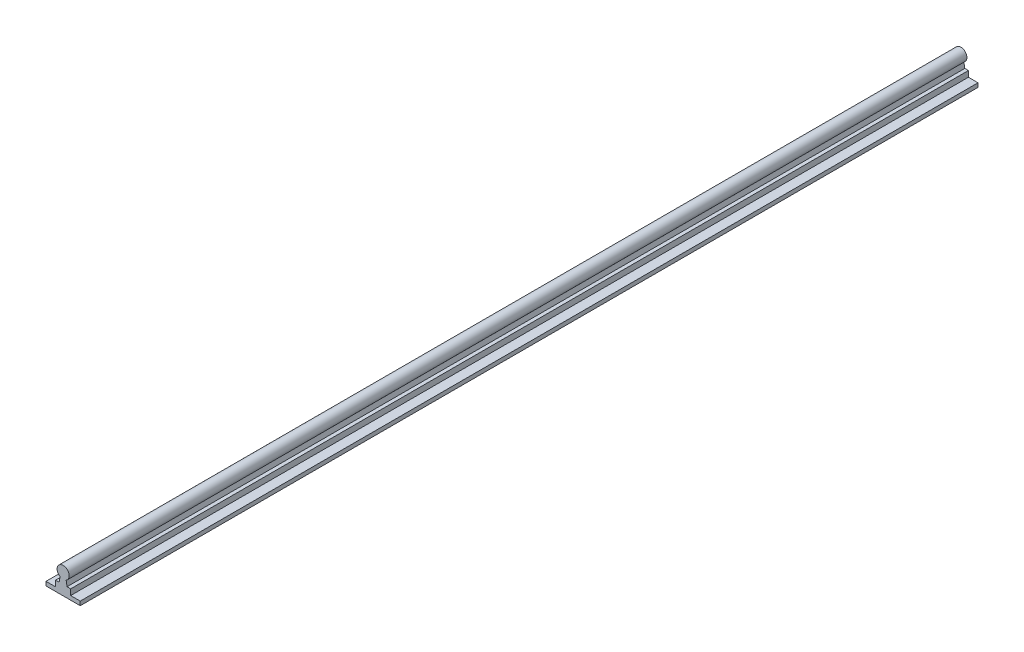
ISO-10303-21;
HEADER;
FILE_DESCRIPTION(('STEP AP214'),'2;1');
FILE_NAME('part.step','',(''),(''),'','','');
FILE_SCHEMA(('AUTOMOTIVE_DESIGN { 1 0 10303 214 1 1 1 1 }'));
ENDSEC;
DATA;
#1=APPLICATION_CONTEXT('core data for automotive mechanical design processes');
#2=APPLICATION_PROTOCOL_DEFINITION('international standard','automotive_design',2000,#1);
#3=PRODUCT_CONTEXT('',#1,'mechanical');
#4=PRODUCT('Part','Part','',(#3));
#5=PRODUCT_RELATED_PRODUCT_CATEGORY('part','',(#4));
#6=PRODUCT_DEFINITION_FORMATION('','',#4);
#7=PRODUCT_DEFINITION_CONTEXT('part definition',#1,'design');
#8=PRODUCT_DEFINITION('design','',#6,#7);
#9=PRODUCT_DEFINITION_SHAPE('','',#8);
#10=(LENGTH_UNIT() NAMED_UNIT(*) SI_UNIT(.MILLI.,.METRE.));
#11=(NAMED_UNIT(*) PLANE_ANGLE_UNIT() SI_UNIT($,.RADIAN.));
#12=(NAMED_UNIT(*) SI_UNIT($,.STERADIAN.) SOLID_ANGLE_UNIT());
#13=UNCERTAINTY_MEASURE_WITH_UNIT(LENGTH_MEASURE(1.E-05),#10,'distance_accuracy_value','');
#14=(GEOMETRIC_REPRESENTATION_CONTEXT(3) GLOBAL_UNCERTAINTY_ASSIGNED_CONTEXT((#13)) GLOBAL_UNIT_ASSIGNED_CONTEXT((#10,
#11,#12)) REPRESENTATION_CONTEXT('',''));
#15=CARTESIAN_POINT('',(0.,0.,0.));
#16=DIRECTION('',(0.,0.,1.));
#17=DIRECTION('',(1.,0.,0.));
#18=AXIS2_PLACEMENT_3D('',#15,#16,#17);
#19=CARTESIAN_POINT('',(21.3074577548358,0.,891.7));
#20=DIRECTION('',(-1.,0.,0.));
#21=DIRECTION('',(0.,-1.,0.));
#22=AXIS2_PLACEMENT_3D('',#19,#20,#21);
#23=PLANE('',#22);
#24=DIRECTION('',(0.,1.,0.));
#25=VECTOR('',#24,1.);
#26=CARTESIAN_POINT('',(21.3074577548358,0.,0.));
#27=LINE('',#26,#25);
#28=CARTESIAN_POINT('',(21.3074577548358,0.,0.));
#29=VERTEX_POINT('',#28);
#30=CARTESIAN_POINT('',(21.3074577548358,4.,0.));
#31=VERTEX_POINT('',#30);
#32=EDGE_CURVE('E151',#29,#31,#27,.T.);
#33=ORIENTED_EDGE('',*,*,#32,.T.);
#34=DIRECTION('',(0.,0.,-1.));
#35=VECTOR('',#34,1.);
#36=CARTESIAN_POINT('',(21.3074577548358,4.,891.7));
#37=LINE('',#36,#35);
#38=CARTESIAN_POINT('',(21.3074577548358,4.,891.7));
#39=VERTEX_POINT('',#38);
#40=EDGE_CURVE('E11',#39,#31,#37,.T.);
#41=ORIENTED_EDGE('',*,*,#40,.F.);
#42=DIRECTION('',(0.,1.,0.));
#43=VECTOR('',#42,1.);
#44=CARTESIAN_POINT('',(21.3074577548358,0.,891.7));
#45=LINE('',#44,#43);
#46=CARTESIAN_POINT('',(21.3074577548358,0.,891.7));
#47=VERTEX_POINT('',#46);
#48=EDGE_CURVE('E173',#47,#39,#45,.T.);
#49=ORIENTED_EDGE('',*,*,#48,.F.);
#50=DIRECTION('',(0.,0.,-1.));
#51=VECTOR('',#50,1.);
#52=CARTESIAN_POINT('',(21.3074577548358,0.,891.7));
#53=LINE('',#52,#51);
#54=EDGE_CURVE('E147',#47,#29,#53,.T.);
#55=ORIENTED_EDGE('',*,*,#54,.T.);
#56=EDGE_LOOP('',(#33,#41,#49,#55));
#57=FACE_BOUND('',#56,.T.);
#58=ADVANCED_FACE('F31',(#57),#23,.F.);
#59=CARTESIAN_POINT('',(21.3074577548358,4.,891.7));
#60=DIRECTION('',(0.,-1.,0.));
#61=DIRECTION('',(1.,0.,0.));
#62=AXIS2_PLACEMENT_3D('',#59,#60,#61);
#63=PLANE('',#62);
#64=DIRECTION('',(-1.,0.,0.));
#65=VECTOR('',#64,1.);
#66=CARTESIAN_POINT('',(21.3074577548358,4.,0.));
#67=LINE('',#66,#65);
#68=CARTESIAN_POINT('',(11.8074577548358,3.99999999999999,0.));
#69=VERTEX_POINT('',#68);
#70=EDGE_CURVE('E154',#31,#69,#67,.T.);
#71=ORIENTED_EDGE('',*,*,#70,.T.);
#72=DIRECTION('',(0.,0.,-1.));
#73=VECTOR('',#72,1.);
#74=CARTESIAN_POINT('',(11.8074577548358,3.99999999999999,891.7));
#75=LINE('',#74,#73);
#76=CARTESIAN_POINT('',(11.8074577548358,3.99999999999999,891.7));
#77=VERTEX_POINT('',#76);
#78=EDGE_CURVE('E39',#77,#69,#75,.T.);
#79=ORIENTED_EDGE('',*,*,#78,.F.);
#80=DIRECTION('',(-1.,0.,0.));
#81=VECTOR('',#80,1.);
#82=CARTESIAN_POINT('',(21.3074577548358,4.,891.7));
#83=LINE('',#82,#81);
#84=EDGE_CURVE('E102',#39,#77,#83,.T.);
#85=ORIENTED_EDGE('',*,*,#84,.F.);
#86=ORIENTED_EDGE('',*,*,#40,.T.);
#87=EDGE_LOOP('',(#71,#79,#85,#86));
#88=FACE_BOUND('',#87,.T.);
#89=ADVANCED_FACE('F251',(#88),#63,.F.);
#90=CARTESIAN_POINT('',(11.8074577548358,3.99999999999999,891.7));
#91=DIRECTION('',(-1.,0.,0.));
#92=DIRECTION('',(0.,0.,1.));
#93=AXIS2_PLACEMENT_3D('',#90,#91,#92);
#94=PLANE('',#93);
#95=DIRECTION('',(0.,1.,0.));
#96=VECTOR('',#95,1.);
#97=CARTESIAN_POINT('',(11.8074577548358,3.99999999999999,0.));
#98=LINE('',#97,#96);
#99=CARTESIAN_POINT('',(11.8074577548358,9.8,0.));
#100=VERTEX_POINT('',#99);
#101=EDGE_CURVE('E156',#69,#100,#98,.T.);
#102=ORIENTED_EDGE('',*,*,#101,.T.);
#103=DIRECTION('',(0.,0.,-1.));
#104=VECTOR('',#103,1.);
#105=CARTESIAN_POINT('',(11.8074577548358,9.8,891.7));
#106=LINE('',#105,#104);
#107=CARTESIAN_POINT('',(11.8074577548358,9.8,891.7));
#108=VERTEX_POINT('',#107);
#109=EDGE_CURVE('E192',#108,#100,#106,.T.);
#110=ORIENTED_EDGE('',*,*,#109,.F.);
#111=DIRECTION('',(0.,1.,0.));
#112=VECTOR('',#111,1.);
#113=CARTESIAN_POINT('',(11.8074577548358,3.99999999999999,891.7));
#114=LINE('',#113,#112);
#115=EDGE_CURVE('E200',#77,#108,#114,.T.);
#116=ORIENTED_EDGE('',*,*,#115,.F.);
#117=ORIENTED_EDGE('',*,*,#78,.T.);
#118=EDGE_LOOP('',(#102,#110,#116,#117));
#119=FACE_BOUND('',#118,.T.);
#120=ADVANCED_FACE('F198',(#119),#94,.F.);
#121=CARTESIAN_POINT('',(11.8074577548358,9.8,891.7));
#122=DIRECTION('',(0.,-1.,0.));
#123=DIRECTION('',(0.,0.,-1.));
#124=AXIS2_PLACEMENT_3D('',#121,#122,#123);
#125=PLANE('',#124);
#126=DIRECTION('',(-1.,0.,0.));
#127=VECTOR('',#126,1.);
#128=CARTESIAN_POINT('',(11.8074577548358,9.8,0.));
#129=LINE('',#128,#127);
#130=CARTESIAN_POINT('',(8.22435805451978,9.8,0.));
#131=VERTEX_POINT('',#130);
#132=EDGE_CURVE('E158',#100,#131,#129,.T.);
#133=ORIENTED_EDGE('',*,*,#132,.T.);
#134=DIRECTION('',(0.,0.,-1.));
#135=VECTOR('',#134,1.);
#136=CARTESIAN_POINT('',(8.22435805451978,9.8,891.7));
#137=LINE('',#136,#135);
#138=CARTESIAN_POINT('',(8.22435805451978,9.8,891.7));
#139=VERTEX_POINT('',#138);
#140=EDGE_CURVE('E189',#139,#131,#137,.T.);
#141=ORIENTED_EDGE('',*,*,#140,.F.);
#142=DIRECTION('',(-1.,0.,0.));
#143=VECTOR('',#142,1.);
#144=CARTESIAN_POINT('',(11.8074577548358,9.8,891.7));
#145=LINE('',#144,#143);
#146=EDGE_CURVE('E218',#108,#139,#145,.T.);
#147=ORIENTED_EDGE('',*,*,#146,.F.);
#148=ORIENTED_EDGE('',*,*,#109,.T.);
#149=EDGE_LOOP('',(#133,#141,#147,#148));
#150=FACE_BOUND('',#149,.T.);
#151=ADVANCED_FACE('F209',(#150),#125,.F.);
#152=CARTESIAN_POINT('',(8.22435805451978,9.8,891.7));
#153=DIRECTION('',(-0.984807753012209,-0.173648177666927,0.));
#154=DIRECTION('',(0.173648177666927,-0.984807753012209,0.));
#155=AXIS2_PLACEMENT_3D('',#152,#153,#154);
#156=PLANE('',#155);
#157=DIRECTION('',(-0.173648177666927,0.984807753012209,0.));
#158=VECTOR('',#157,1.);
#159=CARTESIAN_POINT('',(8.22435805451978,9.8,0.));
#160=LINE('',#159,#158);
#161=CARTESIAN_POINT('',(7.30745775483578,15.,0.));
#162=VERTEX_POINT('',#161);
#163=EDGE_CURVE('E160',#131,#162,#160,.T.);
#164=ORIENTED_EDGE('',*,*,#163,.T.);
#165=DIRECTION('',(0.,0.,-1.));
#166=VECTOR('',#165,1.);
#167=CARTESIAN_POINT('',(7.30745775483578,15.,891.7));
#168=LINE('',#167,#166);
#169=CARTESIAN_POINT('',(7.30745775483578,15.,891.7));
#170=VERTEX_POINT('',#169);
#171=EDGE_CURVE('E186',#170,#162,#168,.T.);
#172=ORIENTED_EDGE('',*,*,#171,.F.);
#173=DIRECTION('',(-0.173648177666927,0.984807753012209,0.));
#174=VECTOR('',#173,1.);
#175=CARTESIAN_POINT('',(8.22435805451978,9.8,891.7));
#176=LINE('',#175,#174);
#177=EDGE_CURVE('E215',#139,#170,#176,.T.);
#178=ORIENTED_EDGE('',*,*,#177,.F.);
#179=ORIENTED_EDGE('',*,*,#140,.T.);
#180=EDGE_LOOP('',(#164,#172,#178,#179));
#181=FACE_BOUND('',#180,.T.);
#182=ADVANCED_FACE('F213',(#181),#156,.F.);
#183=CARTESIAN_POINT('',(4.30745775483578,20.1961524227066,891.7));
#184=DIRECTION('',(0.,0.,-1.));
#185=DIRECTION('',(-1.,0.,0.));
#186=AXIS2_PLACEMENT_3D('',#183,#184,#185);
#187=CYLINDRICAL_SURFACE('',#186,6.);
#188=CARTESIAN_POINT('',(4.30745775483578,20.1961524227066,0.));
#189=DIRECTION('',(0.,0.,1.));
#190=DIRECTION('',(1.,0.,0.));
#191=AXIS2_PLACEMENT_3D('',#188,#189,#190);
#192=CIRCLE('',#191,6.);
#193=CARTESIAN_POINT('',(1.30745775483578,15.,0.));
#194=VERTEX_POINT('',#193);
#195=EDGE_CURVE('E162',#162,#194,#192,.T.);
#196=ORIENTED_EDGE('',*,*,#195,.T.);
#197=DIRECTION('',(0.,0.,-1.));
#198=VECTOR('',#197,1.);
#199=CARTESIAN_POINT('',(1.30745775483578,15.,891.7));
#200=LINE('',#199,#198);
#201=CARTESIAN_POINT('',(1.30745775483578,15.,891.7));
#202=VERTEX_POINT('',#201);
#203=EDGE_CURVE('E183',#202,#194,#200,.T.);
#204=ORIENTED_EDGE('',*,*,#203,.F.);
#205=CARTESIAN_POINT('',(4.30745775483578,20.1961524227066,891.7));
#206=DIRECTION('',(0.,0.,1.));
#207=DIRECTION('',(1.,0.,0.));
#208=AXIS2_PLACEMENT_3D('',#205,#206,#207);
#209=CIRCLE('',#208,6.);
#210=EDGE_CURVE('E217',#170,#202,#209,.T.);
#211=ORIENTED_EDGE('',*,*,#210,.F.);
#212=ORIENTED_EDGE('',*,*,#171,.T.);
#213=EDGE_LOOP('',(#196,#204,#211,#212));
#214=FACE_BOUND('',#213,.T.);
#215=ADVANCED_FACE('F264',(#214),#187,.T.);
#216=CARTESIAN_POINT('',(0.390557455151781,9.8,891.7));
#217=DIRECTION('',(0.984807753012209,-0.173648177666927,0.));
#218=DIRECTION('',(0.173648177666927,0.984807753012209,0.));
#219=AXIS2_PLACEMENT_3D('',#216,#217,#218);
#220=PLANE('',#219);
#221=DIRECTION('',(-0.173648177666927,-0.984807753012209,0.));
#222=VECTOR('',#221,1.);
#223=CARTESIAN_POINT('',(0.390557455151781,9.8,0.));
#224=LINE('',#223,#222);
#225=CARTESIAN_POINT('',(0.390557455151781,9.8,0.));
#226=VERTEX_POINT('',#225);
#227=EDGE_CURVE('E164',#194,#226,#224,.T.);
#228=ORIENTED_EDGE('',*,*,#227,.T.);
#229=DIRECTION('',(0.,0.,-1.));
#230=VECTOR('',#229,1.);
#231=CARTESIAN_POINT('',(0.390557455151781,9.8,891.7));
#232=LINE('',#231,#230);
#233=CARTESIAN_POINT('',(0.390557455151781,9.8,891.7));
#234=VERTEX_POINT('',#233);
#235=EDGE_CURVE('E180',#234,#226,#232,.T.);
#236=ORIENTED_EDGE('',*,*,#235,.F.);
#237=DIRECTION('',(-0.173648177666927,-0.984807753012209,0.));
#238=VECTOR('',#237,1.);
#239=CARTESIAN_POINT('',(0.390557455151781,9.8,891.7));
#240=LINE('',#239,#238);
#241=EDGE_CURVE('E220',#202,#234,#240,.T.);
#242=ORIENTED_EDGE('',*,*,#241,.F.);
#243=ORIENTED_EDGE('',*,*,#203,.T.);
#244=EDGE_LOOP('',(#228,#236,#242,#243));
#245=FACE_BOUND('',#244,.T.);
#246=ADVANCED_FACE('F267',(#245),#220,.F.);
#247=CARTESIAN_POINT('',(-3.19254224516422,9.8,891.7));
#248=DIRECTION('',(0.,-1.,0.));
#249=DIRECTION('',(0.,0.,-1.));
#250=AXIS2_PLACEMENT_3D('',#247,#248,#249);
#251=PLANE('',#250);
#252=DIRECTION('',(-1.,0.,0.));
#253=VECTOR('',#252,1.);
#254=CARTESIAN_POINT('',(-3.19254224516422,9.8,0.));
#255=LINE('',#254,#253);
#256=CARTESIAN_POINT('',(-3.19254224516422,9.8,0.));
#257=VERTEX_POINT('',#256);
#258=EDGE_CURVE('E166',#226,#257,#255,.T.);
#259=ORIENTED_EDGE('',*,*,#258,.T.);
#260=DIRECTION('',(0.,0.,-1.));
#261=VECTOR('',#260,1.);
#262=CARTESIAN_POINT('',(-3.19254224516422,9.8,891.7));
#263=LINE('',#262,#261);
#264=CARTESIAN_POINT('',(-3.19254224516422,9.8,891.7));
#265=VERTEX_POINT('',#264);
#266=EDGE_CURVE('E177',#265,#257,#263,.T.);
#267=ORIENTED_EDGE('',*,*,#266,.F.);
#268=DIRECTION('',(-1.,0.,0.));
#269=VECTOR('',#268,1.);
#270=CARTESIAN_POINT('',(-3.19254224516422,9.8,891.7));
#271=LINE('',#270,#269);
#272=EDGE_CURVE('E226',#234,#265,#271,.T.);
#273=ORIENTED_EDGE('',*,*,#272,.F.);
#274=ORIENTED_EDGE('',*,*,#235,.T.);
#275=EDGE_LOOP('',(#259,#267,#273,#274));
#276=FACE_BOUND('',#275,.T.);
#277=ADVANCED_FACE('F232',(#276),#251,.F.);
#278=CARTESIAN_POINT('',(-3.19254224516422,3.99999999999999,891.7));
#279=DIRECTION('',(1.,0.,0.));
#280=DIRECTION('',(0.,0.,-1.));
#281=AXIS2_PLACEMENT_3D('',#278,#279,#280);
#282=PLANE('',#281);
#283=DIRECTION('',(0.,-1.,0.));
#284=VECTOR('',#283,1.);
#285=CARTESIAN_POINT('',(-3.19254224516422,3.99999999999999,0.));
#286=LINE('',#285,#284);
#287=CARTESIAN_POINT('',(-3.19254224516422,3.99999999999999,0.));
#288=VERTEX_POINT('',#287);
#289=EDGE_CURVE('E168',#257,#288,#286,.T.);
#290=ORIENTED_EDGE('',*,*,#289,.T.);
#291=DIRECTION('',(0.,0.,-1.));
#292=VECTOR('',#291,1.);
#293=CARTESIAN_POINT('',(-3.19254224516422,3.99999999999999,891.7));
#294=LINE('',#293,#292);
#295=CARTESIAN_POINT('',(-3.19254224516422,3.99999999999999,891.7));
#296=VERTEX_POINT('',#295);
#297=EDGE_CURVE('E142',#296,#288,#294,.T.);
#298=ORIENTED_EDGE('',*,*,#297,.F.);
#299=DIRECTION('',(0.,-1.,0.));
#300=VECTOR('',#299,1.);
#301=CARTESIAN_POINT('',(-3.19254224516422,3.99999999999999,891.7));
#302=LINE('',#301,#300);
#303=EDGE_CURVE('E133',#265,#296,#302,.T.);
#304=ORIENTED_EDGE('',*,*,#303,.F.);
#305=ORIENTED_EDGE('',*,*,#266,.T.);
#306=EDGE_LOOP('',(#290,#298,#304,#305));
#307=FACE_BOUND('',#306,.T.);
#308=ADVANCED_FACE('F236',(#307),#282,.F.);
#309=CARTESIAN_POINT('',(-12.6925422451642,4.,891.7));
#310=DIRECTION('',(0.,-1.,0.));
#311=DIRECTION('',(1.,0.,0.));
#312=AXIS2_PLACEMENT_3D('',#309,#310,#311);
#313=PLANE('',#312);
#314=DIRECTION('',(-1.,0.,0.));
#315=VECTOR('',#314,1.);
#316=CARTESIAN_POINT('',(-12.6925422451642,4.,0.));
#317=LINE('',#316,#315);
#318=CARTESIAN_POINT('',(-12.6925422451642,4.,0.));
#319=VERTEX_POINT('',#318);
#320=EDGE_CURVE('E141',#288,#319,#317,.T.);
#321=ORIENTED_EDGE('',*,*,#320,.T.);
#322=DIRECTION('',(0.,0.,-1.));
#323=VECTOR('',#322,1.);
#324=CARTESIAN_POINT('',(-12.6925422451642,4.,891.7));
#325=LINE('',#324,#323);
#326=CARTESIAN_POINT('',(-12.6925422451642,4.,891.7));
#327=VERTEX_POINT('',#326);
#328=EDGE_CURVE('E138',#327,#319,#325,.T.);
#329=ORIENTED_EDGE('',*,*,#328,.F.);
#330=DIRECTION('',(-1.,0.,0.));
#331=VECTOR('',#330,1.);
#332=CARTESIAN_POINT('',(-12.6925422451642,4.,891.7));
#333=LINE('',#332,#331);
#334=EDGE_CURVE('E127',#296,#327,#333,.T.);
#335=ORIENTED_EDGE('',*,*,#334,.F.);
#336=ORIENTED_EDGE('',*,*,#297,.T.);
#337=EDGE_LOOP('',(#321,#329,#335,#336));
#338=FACE_BOUND('',#337,.T.);
#339=ADVANCED_FACE('F139',(#338),#313,.F.);
#340=CARTESIAN_POINT('',(-12.6925422451642,0.,891.7));
#341=DIRECTION('',(1.,0.,0.));
#342=DIRECTION('',(0.,1.,0.));
#343=AXIS2_PLACEMENT_3D('',#340,#341,#342);
#344=PLANE('',#343);
#345=DIRECTION('',(0.,-1.,0.));
#346=VECTOR('',#345,1.);
#347=CARTESIAN_POINT('',(-12.6925422451642,0.,0.));
#348=LINE('',#347,#346);
#349=CARTESIAN_POINT('',(-12.6925422451642,0.,0.));
#350=VERTEX_POINT('',#349);
#351=EDGE_CURVE('E88',#319,#350,#348,.T.);
#352=ORIENTED_EDGE('',*,*,#351,.T.);
#353=DIRECTION('',(0.,0.,-1.));
#354=VECTOR('',#353,1.);
#355=CARTESIAN_POINT('',(-12.6925422451642,0.,891.7));
#356=LINE('',#355,#354);
#357=CARTESIAN_POINT('',(-12.6925422451642,0.,891.7));
#358=VERTEX_POINT('',#357);
#359=EDGE_CURVE('E143',#358,#350,#356,.T.);
#360=ORIENTED_EDGE('',*,*,#359,.F.);
#361=DIRECTION('',(0.,-1.,0.));
#362=VECTOR('',#361,1.);
#363=CARTESIAN_POINT('',(-12.6925422451642,0.,891.7));
#364=LINE('',#363,#362);
#365=EDGE_CURVE('E131',#327,#358,#364,.T.);
#366=ORIENTED_EDGE('',*,*,#365,.F.);
#367=ORIENTED_EDGE('',*,*,#328,.T.);
#368=EDGE_LOOP('',(#352,#360,#366,#367));
#369=FACE_BOUND('',#368,.T.);
#370=ADVANCED_FACE('F145',(#369),#344,.F.);
#371=CARTESIAN_POINT('',(21.3074577548358,0.,891.7));
#372=DIRECTION('',(0.,1.,0.));
#373=DIRECTION('',(0.,0.,1.));
#374=AXIS2_PLACEMENT_3D('',#371,#372,#373);
#375=PLANE('',#374);
#376=DIRECTION('',(1.,0.,0.));
#377=VECTOR('',#376,1.);
#378=CARTESIAN_POINT('',(21.3074577548358,0.,0.));
#379=LINE('',#378,#377);
#380=EDGE_CURVE('E94',#350,#29,#379,.T.);
#381=ORIENTED_EDGE('',*,*,#380,.T.);
#382=ORIENTED_EDGE('',*,*,#54,.F.);
#383=DIRECTION('',(1.,0.,0.));
#384=VECTOR('',#383,1.);
#385=CARTESIAN_POINT('',(21.3074577548358,0.,891.7));
#386=LINE('',#385,#384);
#387=EDGE_CURVE('E47',#358,#47,#386,.T.);
#388=ORIENTED_EDGE('',*,*,#387,.F.);
#389=ORIENTED_EDGE('',*,*,#359,.T.);
#390=EDGE_LOOP('',(#381,#382,#388,#389));
#391=FACE_BOUND('',#390,.T.);
#392=ADVANCED_FACE('F240',(#391),#375,.F.);
#393=CARTESIAN_POINT('',(4.30745775483578,20.1961524227066,891.7));
#394=DIRECTION('',(0.,0.,1.));
#395=DIRECTION('',(1.,0.,0.));
#396=AXIS2_PLACEMENT_3D('',#393,#394,#395);
#397=PLANE('',#396);
#398=ORIENTED_EDGE('',*,*,#48,.T.);
#399=ORIENTED_EDGE('',*,*,#84,.T.);
#400=ORIENTED_EDGE('',*,*,#115,.T.);
#401=ORIENTED_EDGE('',*,*,#146,.T.);
#402=ORIENTED_EDGE('',*,*,#177,.T.);
#403=ORIENTED_EDGE('',*,*,#210,.T.);
#404=ORIENTED_EDGE('',*,*,#241,.T.);
#405=ORIENTED_EDGE('',*,*,#272,.T.);
#406=ORIENTED_EDGE('',*,*,#303,.T.);
#407=ORIENTED_EDGE('',*,*,#334,.T.);
#408=ORIENTED_EDGE('',*,*,#365,.T.);
#409=ORIENTED_EDGE('',*,*,#387,.T.);
#410=EDGE_LOOP('',(#398,#399,#400,#401,#402,#403,#404,#405,#406,#407,#408,#409));
#411=FACE_BOUND('',#410,.T.);
#412=ADVANCED_FACE('F129',(#411),#397,.T.);
#413=CARTESIAN_POINT('',(4.30745775483578,20.1961524227066,0.));
#414=DIRECTION('',(0.,0.,1.));
#415=DIRECTION('',(1.,0.,0.));
#416=AXIS2_PLACEMENT_3D('',#413,#414,#415);
#417=PLANE('',#416);
#418=ORIENTED_EDGE('',*,*,#32,.F.);
#419=ORIENTED_EDGE('',*,*,#380,.F.);
#420=ORIENTED_EDGE('',*,*,#351,.F.);
#421=ORIENTED_EDGE('',*,*,#320,.F.);
#422=ORIENTED_EDGE('',*,*,#289,.F.);
#423=ORIENTED_EDGE('',*,*,#258,.F.);
#424=ORIENTED_EDGE('',*,*,#227,.F.);
#425=ORIENTED_EDGE('',*,*,#195,.F.);
#426=ORIENTED_EDGE('',*,*,#163,.F.);
#427=ORIENTED_EDGE('',*,*,#132,.F.);
#428=ORIENTED_EDGE('',*,*,#101,.F.);
#429=ORIENTED_EDGE('',*,*,#70,.F.);
#430=EDGE_LOOP('',(#418,#419,#420,#421,#422,#423,#424,#425,#426,#427,#428,#429));
#431=FACE_BOUND('',#430,.T.);
#432=ADVANCED_FACE('F204',(#431),#417,.F.);
#433=CLOSED_SHELL('',(#58,#89,#120,#151,#182,#215,#246,#277,#308,#339,#370,#392,#412,#432));
#434=MANIFOLD_SOLID_BREP('B2',#433);
#435=ADVANCED_BREP_SHAPE_REPRESENTATION('',(#18,#434),#14);
#436=SHAPE_DEFINITION_REPRESENTATION(#9,#435);
ENDSEC;
END-ISO-10303-21;
